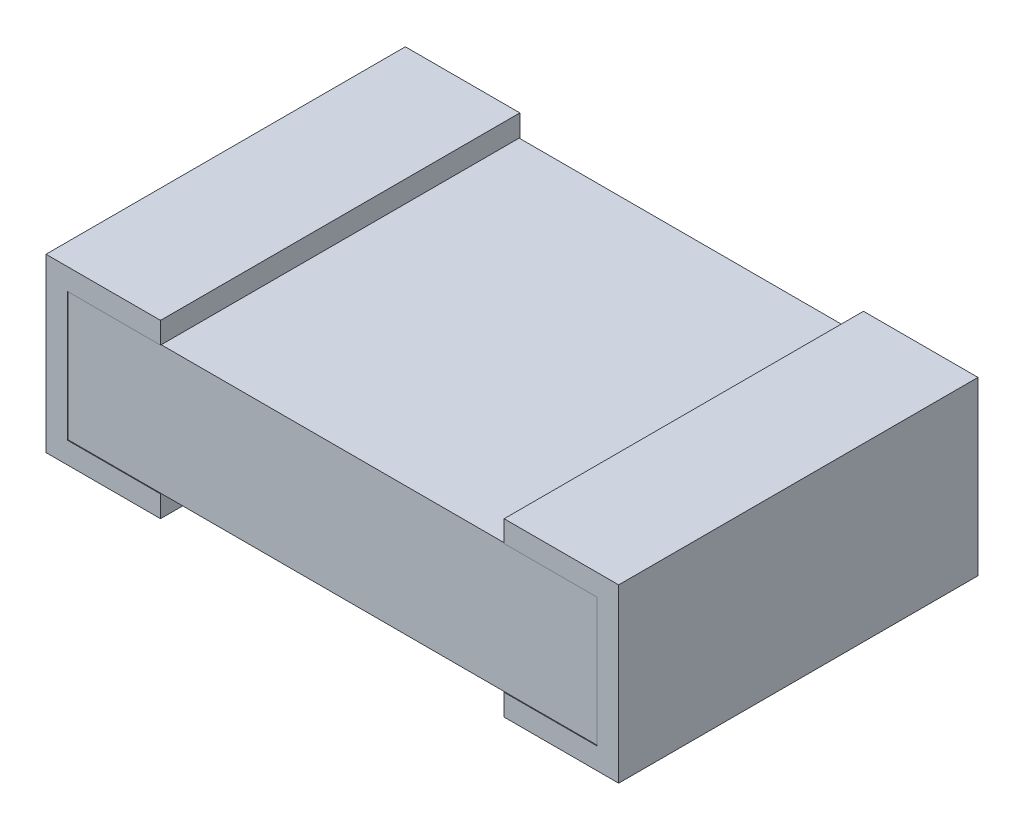
ISO-10303-21;
HEADER;
FILE_DESCRIPTION(('STEP AP214'),'2;1');
FILE_NAME('part.step','',(''),(''),'','','');
FILE_SCHEMA(('AUTOMOTIVE_DESIGN { 1 0 10303 214 1 1 1 1 }'));
ENDSEC;
DATA;
#1=APPLICATION_CONTEXT('core data for automotive mechanical design processes');
#2=APPLICATION_PROTOCOL_DEFINITION('international standard','automotive_design',2000,#1);
#3=PRODUCT_CONTEXT('',#1,'mechanical');
#4=PRODUCT('Part','Part','',(#3));
#5=PRODUCT_RELATED_PRODUCT_CATEGORY('part','',(#4));
#6=PRODUCT_DEFINITION_FORMATION('','',#4);
#7=PRODUCT_DEFINITION_CONTEXT('part definition',#1,'design');
#8=PRODUCT_DEFINITION('design','',#6,#7);
#9=PRODUCT_DEFINITION_SHAPE('','',#8);
#10=(LENGTH_UNIT() NAMED_UNIT(*) SI_UNIT(.MILLI.,.METRE.));
#11=(NAMED_UNIT(*) PLANE_ANGLE_UNIT() SI_UNIT($,.RADIAN.));
#12=(NAMED_UNIT(*) SI_UNIT($,.STERADIAN.) SOLID_ANGLE_UNIT());
#13=UNCERTAINTY_MEASURE_WITH_UNIT(LENGTH_MEASURE(1.E-05),#10,'distance_accuracy_value','');
#14=(GEOMETRIC_REPRESENTATION_CONTEXT(3) GLOBAL_UNCERTAINTY_ASSIGNED_CONTEXT((#13)) GLOBAL_UNIT_ASSIGNED_CONTEXT((#10,
#11,#12)) REPRESENTATION_CONTEXT('',''));
#15=CARTESIAN_POINT('',(0.,0.,0.));
#16=DIRECTION('',(0.,0.,1.));
#17=DIRECTION('',(1.,0.,0.));
#18=AXIS2_PLACEMENT_3D('',#15,#16,#17);
#19=CARTESIAN_POINT('',(1.9558,0.0762000000000002,-0.635));
#20=DIRECTION('',(0.,-1.,0.));
#21=DIRECTION('',(1.,0.,0.));
#22=AXIS2_PLACEMENT_3D('',#19,#20,#21);
#23=PLANE('',#22);
#24=DIRECTION('',(1.,0.,0.));
#25=VECTOR('',#24,1.);
#26=CARTESIAN_POINT('',(1.9558,0.0762000000000002,-0.635));
#27=LINE('',#26,#25);
#28=CARTESIAN_POINT('',(0.4064,0.0762000000000001,-0.635));
#29=VERTEX_POINT('',#28);
#30=CARTESIAN_POINT('',(1.6256,0.0762000000000001,-0.635));
#31=VERTEX_POINT('',#30);
#32=EDGE_CURVE('E41',#29,#31,#27,.T.);
#33=ORIENTED_EDGE('',*,*,#32,.T.);
#34=DIRECTION('',(0.,0.,-1.));
#35=VECTOR('',#34,1.);
#36=CARTESIAN_POINT('',(1.6256,0.0762000000000001,0.63754));
#37=LINE('',#36,#35);
#38=CARTESIAN_POINT('',(1.6256,0.0762000000000001,0.635));
#39=VERTEX_POINT('',#38);
#40=EDGE_CURVE('E272',#39,#31,#37,.T.);
#41=ORIENTED_EDGE('',*,*,#40,.F.);
#42=DIRECTION('',(1.,0.,0.));
#43=VECTOR('',#42,1.);
#44=CARTESIAN_POINT('',(1.9558,0.0762000000000002,0.635));
#45=LINE('',#44,#43);
#46=CARTESIAN_POINT('',(0.4064,0.0762000000000001,0.635));
#47=VERTEX_POINT('',#46);
#48=EDGE_CURVE('E371',#47,#39,#45,.T.);
#49=ORIENTED_EDGE('',*,*,#48,.F.);
#50=DIRECTION('',(0.,0.,-1.));
#51=VECTOR('',#50,1.);
#52=CARTESIAN_POINT('',(0.4064,0.0762000000000001,0.63754));
#53=LINE('',#52,#51);
#54=EDGE_CURVE('E333',#47,#29,#53,.T.);
#55=ORIENTED_EDGE('',*,*,#54,.T.);
#56=EDGE_LOOP('',(#33,#41,#49,#55));
#57=FACE_BOUND('',#56,.T.);
#58=ADVANCED_FACE('F32',(#57),#23,.T.);
#59=CARTESIAN_POINT('',(0.0762,0.5334,-0.635));
#60=DIRECTION('',(0.,1.,0.));
#61=DIRECTION('',(-1.,0.,0.));
#62=AXIS2_PLACEMENT_3D('',#59,#60,#61);
#63=PLANE('',#62);
#64=DIRECTION('',(-1.,0.,0.));
#65=VECTOR('',#64,1.);
#66=CARTESIAN_POINT('',(0.0762,0.5334,0.635));
#67=LINE('',#66,#65);
#68=CARTESIAN_POINT('',(1.6256,0.5334,0.635));
#69=VERTEX_POINT('',#68);
#70=CARTESIAN_POINT('',(0.4064,0.5334,0.635));
#71=VERTEX_POINT('',#70);
#72=EDGE_CURVE('E364',#69,#71,#67,.T.);
#73=ORIENTED_EDGE('',*,*,#72,.F.);
#74=DIRECTION('',(0.,0.,-1.));
#75=VECTOR('',#74,1.);
#76=CARTESIAN_POINT('',(1.6256,0.5334,0.63754));
#77=LINE('',#76,#75);
#78=CARTESIAN_POINT('',(1.6256,0.5334,-0.635));
#79=VERTEX_POINT('',#78);
#80=EDGE_CURVE('E261',#69,#79,#77,.T.);
#81=ORIENTED_EDGE('',*,*,#80,.T.);
#82=DIRECTION('',(-1.,0.,0.));
#83=VECTOR('',#82,1.);
#84=CARTESIAN_POINT('',(0.0762,0.5334,-0.635));
#85=LINE('',#84,#83);
#86=CARTESIAN_POINT('',(0.4064,0.5334,-0.635));
#87=VERTEX_POINT('',#86);
#88=EDGE_CURVE('E353',#79,#87,#85,.T.);
#89=ORIENTED_EDGE('',*,*,#88,.T.);
#90=DIRECTION('',(0.,0.,-1.));
#91=VECTOR('',#90,1.);
#92=CARTESIAN_POINT('',(0.4064,0.5334,0.63754));
#93=LINE('',#92,#91);
#94=EDGE_CURVE('E344',#71,#87,#93,.T.);
#95=ORIENTED_EDGE('',*,*,#94,.F.);
#96=EDGE_LOOP('',(#73,#81,#89,#95));
#97=FACE_BOUND('',#96,.T.);
#98=ADVANCED_FACE('F34',(#97),#63,.T.);
#99=CARTESIAN_POINT('',(1.9558,0.5334,-0.635));
#100=DIRECTION('',(0.,0.,-1.));
#101=DIRECTION('',(-1.,0.,0.));
#102=AXIS2_PLACEMENT_3D('',#99,#100,#101);
#103=PLANE('',#102);
#104=DIRECTION('',(0.,1.,0.));
#105=VECTOR('',#104,1.);
#106=CARTESIAN_POINT('',(1.9558,0.0762000000000002,-0.635));
#107=LINE('',#106,#105);
#108=CARTESIAN_POINT('',(1.9558,0.0762,-0.635));
#109=VERTEX_POINT('',#108);
#110=CARTESIAN_POINT('',(1.9558,0.5334,-0.635));
#111=VERTEX_POINT('',#110);
#112=EDGE_CURVE('E351',#109,#111,#107,.T.);
#113=ORIENTED_EDGE('',*,*,#112,.F.);
#114=DIRECTION('',(-1.,0.,0.));
#115=VECTOR('',#114,1.);
#116=CARTESIAN_POINT('',(1.9558,0.0762,-0.635));
#117=LINE('',#116,#115);
#118=EDGE_CURVE('E254',#109,#31,#117,.T.);
#119=ORIENTED_EDGE('',*,*,#118,.T.);
#120=ORIENTED_EDGE('',*,*,#32,.F.);
#121=CARTESIAN_POINT('',(0.0762,0.0762,-0.635));
#122=VERTEX_POINT('',#121);
#123=EDGE_CURVE('E11',#122,#29,#27,.T.);
#124=ORIENTED_EDGE('',*,*,#123,.F.);
#125=DIRECTION('',(0.,-1.,0.));
#126=VECTOR('',#125,1.);
#127=CARTESIAN_POINT('',(0.0762,0.5334,-0.635));
#128=LINE('',#127,#126);
#129=CARTESIAN_POINT('',(0.0762,0.5334,-0.635));
#130=VERTEX_POINT('',#129);
#131=EDGE_CURVE('E356',#130,#122,#128,.T.);
#132=ORIENTED_EDGE('',*,*,#131,.F.);
#133=DIRECTION('',(-1.,0.,0.));
#134=VECTOR('',#133,1.);
#135=CARTESIAN_POINT('',(1.9558,0.5334,-0.635));
#136=LINE('',#135,#134);
#137=EDGE_CURVE('E327',#87,#130,#136,.T.);
#138=ORIENTED_EDGE('',*,*,#137,.F.);
#139=ORIENTED_EDGE('',*,*,#88,.F.);
#140=EDGE_CURVE('E354',#111,#79,#85,.T.);
#141=ORIENTED_EDGE('',*,*,#140,.F.);
#142=EDGE_LOOP('',(#113,#119,#120,#124,#132,#138,#139,#141));
#143=FACE_BOUND('',#142,.T.);
#144=ADVANCED_FACE('F435',(#143),#103,.T.);
#145=CARTESIAN_POINT('',(1.9558,0.5334,0.635));
#146=DIRECTION('',(0.,0.,-1.));
#147=DIRECTION('',(-1.,0.,0.));
#148=AXIS2_PLACEMENT_3D('',#145,#146,#147);
#149=PLANE('',#148);
#150=DIRECTION('',(0.,1.,0.));
#151=VECTOR('',#150,1.);
#152=CARTESIAN_POINT('',(1.9558,0.0762000000000002,0.635));
#153=LINE('',#152,#151);
#154=CARTESIAN_POINT('',(1.9558,0.0762000000000002,0.635));
#155=VERTEX_POINT('',#154);
#156=CARTESIAN_POINT('',(1.9558,0.5334,0.635));
#157=VERTEX_POINT('',#156);
#158=EDGE_CURVE('E350',#155,#157,#153,.T.);
#159=ORIENTED_EDGE('',*,*,#158,.T.);
#160=EDGE_CURVE('E361',#157,#69,#67,.T.);
#161=ORIENTED_EDGE('',*,*,#160,.T.);
#162=ORIENTED_EDGE('',*,*,#72,.T.);
#163=CARTESIAN_POINT('',(0.0762,0.5334,0.635));
#164=VERTEX_POINT('',#163);
#165=EDGE_CURVE('E360',#71,#164,#67,.T.);
#166=ORIENTED_EDGE('',*,*,#165,.T.);
#167=DIRECTION('',(0.,-1.,0.));
#168=VECTOR('',#167,1.);
#169=CARTESIAN_POINT('',(0.0762,0.5334,0.635));
#170=LINE('',#169,#168);
#171=CARTESIAN_POINT('',(0.0762,0.0762,0.635));
#172=VERTEX_POINT('',#171);
#173=EDGE_CURVE('E363',#164,#172,#170,.T.);
#174=ORIENTED_EDGE('',*,*,#173,.T.);
#175=EDGE_CURVE('E36',#172,#47,#45,.T.);
#176=ORIENTED_EDGE('',*,*,#175,.T.);
#177=ORIENTED_EDGE('',*,*,#48,.T.);
#178=EDGE_CURVE('E366',#39,#155,#45,.T.);
#179=ORIENTED_EDGE('',*,*,#178,.T.);
#180=EDGE_LOOP('',(#159,#161,#162,#166,#174,#176,#177,#179));
#181=FACE_BOUND('',#180,.T.);
#182=ADVANCED_FACE('F373',(#181),#149,.F.);
#183=CARTESIAN_POINT('',(0.0762,0.0762,0.63754));
#184=DIRECTION('',(0.,1.,0.));
#185=DIRECTION('',(-1.,0.,0.));
#186=AXIS2_PLACEMENT_3D('',#183,#184,#185);
#187=PLANE('',#186);
#188=ORIENTED_EDGE('',*,*,#175,.F.);
#189=DIRECTION('',(0.,0.,-1.));
#190=VECTOR('',#189,1.);
#191=CARTESIAN_POINT('',(0.0762,0.0762,0.63754));
#192=LINE('',#191,#190);
#193=CARTESIAN_POINT('',(0.0762,0.0762,0.63754));
#194=VERTEX_POINT('',#193);
#195=EDGE_CURVE('E335',#194,#172,#192,.T.);
#196=ORIENTED_EDGE('',*,*,#195,.F.);
#197=DIRECTION('',(1.,0.,0.));
#198=VECTOR('',#197,1.);
#199=CARTESIAN_POINT('',(0.0762,0.0762,0.63754));
#200=LINE('',#199,#198);
#201=CARTESIAN_POINT('',(0.4064,0.0762000000000001,0.63754));
#202=VERTEX_POINT('',#201);
#203=EDGE_CURVE('E293',#194,#202,#200,.T.);
#204=ORIENTED_EDGE('',*,*,#203,.T.);
#205=EDGE_CURVE('E330',#202,#47,#53,.T.);
#206=ORIENTED_EDGE('',*,*,#205,.T.);
#207=EDGE_LOOP('',(#188,#196,#204,#206));
#208=FACE_BOUND('',#207,.T.);
#209=ADVANCED_FACE('F376',(#208),#187,.T.);
#210=CARTESIAN_POINT('',(0.0762,0.5334,0.63754));
#211=DIRECTION('',(1.,0.,0.));
#212=DIRECTION('',(0.,0.,-1.));
#213=AXIS2_PLACEMENT_3D('',#210,#211,#212);
#214=PLANE('',#213);
#215=ORIENTED_EDGE('',*,*,#173,.F.);
#216=DIRECTION('',(0.,0.,-1.));
#217=VECTOR('',#216,1.);
#218=CARTESIAN_POINT('',(0.0762,0.5334,0.63754));
#219=LINE('',#218,#217);
#220=CARTESIAN_POINT('',(0.0762,0.5334,0.63754));
#221=VERTEX_POINT('',#220);
#222=EDGE_CURVE('E57',#221,#164,#219,.T.);
#223=ORIENTED_EDGE('',*,*,#222,.F.);
#224=DIRECTION('',(0.,-1.,0.));
#225=VECTOR('',#224,1.);
#226=CARTESIAN_POINT('',(0.0762,0.5334,0.63754));
#227=LINE('',#226,#225);
#228=EDGE_CURVE('E290',#221,#194,#227,.T.);
#229=ORIENTED_EDGE('',*,*,#228,.T.);
#230=ORIENTED_EDGE('',*,*,#195,.T.);
#231=EDGE_LOOP('',(#215,#223,#229,#230));
#232=FACE_BOUND('',#231,.T.);
#233=ADVANCED_FACE('F379',(#232),#214,.T.);
#234=CARTESIAN_POINT('',(0.4064,0.5334,0.63754));
#235=DIRECTION('',(0.,-1.,0.));
#236=DIRECTION('',(0.,0.,-1.));
#237=AXIS2_PLACEMENT_3D('',#234,#235,#236);
#238=PLANE('',#237);
#239=ORIENTED_EDGE('',*,*,#165,.F.);
#240=CARTESIAN_POINT('',(0.4064,0.5334,0.63754));
#241=VERTEX_POINT('',#240);
#242=EDGE_CURVE('E341',#241,#71,#93,.T.);
#243=ORIENTED_EDGE('',*,*,#242,.F.);
#244=DIRECTION('',(-1.,0.,0.));
#245=VECTOR('',#244,1.);
#246=CARTESIAN_POINT('',(0.4064,0.5334,0.63754));
#247=LINE('',#246,#245);
#248=EDGE_CURVE('E288',#241,#221,#247,.T.);
#249=ORIENTED_EDGE('',*,*,#248,.T.);
#250=ORIENTED_EDGE('',*,*,#222,.T.);
#251=EDGE_LOOP('',(#239,#243,#249,#250));
#252=FACE_BOUND('',#251,.T.);
#253=ADVANCED_FACE('F387',(#252),#238,.T.);
#254=CARTESIAN_POINT('',(0.,0.,0.63754));
#255=DIRECTION('',(-1.,0.,0.));
#256=DIRECTION('',(0.,0.,1.));
#257=AXIS2_PLACEMENT_3D('',#254,#255,#256);
#258=PLANE('',#257);
#259=DIRECTION('',(0.,1.,0.));
#260=VECTOR('',#259,1.);
#261=CARTESIAN_POINT('',(0.,0.,-0.63754));
#262=LINE('',#261,#260);
#263=CARTESIAN_POINT('',(0.,0.,-0.63754));
#264=VERTEX_POINT('',#263);
#265=CARTESIAN_POINT('',(0.,0.6096,-0.63754));
#266=VERTEX_POINT('',#265);
#267=EDGE_CURVE('E277',#264,#266,#262,.T.);
#268=ORIENTED_EDGE('',*,*,#267,.F.);
#269=DIRECTION('',(0.,0.,-1.));
#270=VECTOR('',#269,1.);
#271=CARTESIAN_POINT('',(0.,0.,0.63754));
#272=LINE('',#271,#270);
#273=CARTESIAN_POINT('',(0.,0.,0.63754));
#274=VERTEX_POINT('',#273);
#275=EDGE_CURVE('E325',#274,#264,#272,.T.);
#276=ORIENTED_EDGE('',*,*,#275,.F.);
#277=DIRECTION('',(0.,1.,0.));
#278=VECTOR('',#277,1.);
#279=CARTESIAN_POINT('',(0.,0.,0.63754));
#280=LINE('',#279,#278);
#281=CARTESIAN_POINT('',(0.,0.6096,0.63754));
#282=VERTEX_POINT('',#281);
#283=EDGE_CURVE('E278',#274,#282,#280,.T.);
#284=ORIENTED_EDGE('',*,*,#283,.T.);
#285=DIRECTION('',(0.,0.,-1.));
#286=VECTOR('',#285,1.);
#287=CARTESIAN_POINT('',(0.,0.6096,0.63754));
#288=LINE('',#287,#286);
#289=EDGE_CURVE('E302',#282,#266,#288,.T.);
#290=ORIENTED_EDGE('',*,*,#289,.T.);
#291=EDGE_LOOP('',(#268,#276,#284,#290));
#292=FACE_BOUND('',#291,.T.);
#293=ADVANCED_FACE('F413',(#292),#258,.T.);
#294=CARTESIAN_POINT('',(0.,0.,0.63754));
#295=DIRECTION('',(0.,-1.,0.));
#296=DIRECTION('',(1.,0.,0.));
#297=AXIS2_PLACEMENT_3D('',#294,#295,#296);
#298=PLANE('',#297);
#299=DIRECTION('',(-1.,0.,0.));
#300=VECTOR('',#299,1.);
#301=CARTESIAN_POINT('',(0.,0.,-0.63754));
#302=LINE('',#301,#300);
#303=CARTESIAN_POINT('',(0.4064,0.,-0.63754));
#304=VERTEX_POINT('',#303);
#305=EDGE_CURVE('E282',#304,#264,#302,.T.);
#306=ORIENTED_EDGE('',*,*,#305,.F.);
#307=DIRECTION('',(0.,0.,-1.));
#308=VECTOR('',#307,1.);
#309=CARTESIAN_POINT('',(0.4064,0.,0.63754));
#310=LINE('',#309,#308);
#311=CARTESIAN_POINT('',(0.4064,0.,0.63754));
#312=VERTEX_POINT('',#311);
#313=EDGE_CURVE('E328',#312,#304,#310,.T.);
#314=ORIENTED_EDGE('',*,*,#313,.F.);
#315=DIRECTION('',(-1.,0.,0.));
#316=VECTOR('',#315,1.);
#317=CARTESIAN_POINT('',(0.,0.,0.63754));
#318=LINE('',#317,#316);
#319=EDGE_CURVE('E299',#312,#274,#318,.T.);
#320=ORIENTED_EDGE('',*,*,#319,.T.);
#321=ORIENTED_EDGE('',*,*,#275,.T.);
#322=EDGE_LOOP('',(#306,#314,#320,#321));
#323=FACE_BOUND('',#322,.T.);
#324=ADVANCED_FACE('F416',(#323),#298,.T.);
#325=CARTESIAN_POINT('',(0.4064,0.,0.63754));
#326=DIRECTION('',(1.,0.,0.));
#327=DIRECTION('',(0.,0.,-1.));
#328=AXIS2_PLACEMENT_3D('',#325,#326,#327);
#329=PLANE('',#328);
#330=DIRECTION('',(0.,-1.,0.));
#331=VECTOR('',#330,1.);
#332=CARTESIAN_POINT('',(0.4064,0.,-0.63754));
#333=LINE('',#332,#331);
#334=CARTESIAN_POINT('',(0.4064,0.0762000000000001,-0.63754));
#335=VERTEX_POINT('',#334);
#336=EDGE_CURVE('E320',#335,#304,#333,.T.);
#337=ORIENTED_EDGE('',*,*,#336,.F.);
#338=EDGE_CURVE('E334',#29,#335,#53,.T.);
#339=ORIENTED_EDGE('',*,*,#338,.F.);
#340=ORIENTED_EDGE('',*,*,#54,.F.);
#341=ORIENTED_EDGE('',*,*,#205,.F.);
#342=DIRECTION('',(0.,-1.,0.));
#343=VECTOR('',#342,1.);
#344=CARTESIAN_POINT('',(0.4064,0.,0.63754));
#345=LINE('',#344,#343);
#346=EDGE_CURVE('E296',#202,#312,#345,.T.);
#347=ORIENTED_EDGE('',*,*,#346,.T.);
#348=ORIENTED_EDGE('',*,*,#313,.T.);
#349=EDGE_LOOP('',(#337,#339,#340,#341,#347,#348));
#350=FACE_BOUND('',#349,.T.);
#351=ADVANCED_FACE('F419',(#350),#329,.T.);
#352=CARTESIAN_POINT('',(0.0762,0.0762,-0.63754));
#353=VERTEX_POINT('',#352);
#354=EDGE_CURVE('E338',#122,#353,#192,.T.);
#355=ORIENTED_EDGE('',*,*,#354,.F.);
#356=ORIENTED_EDGE('',*,*,#123,.T.);
#357=ORIENTED_EDGE('',*,*,#338,.T.);
#358=DIRECTION('',(1.,0.,0.));
#359=VECTOR('',#358,1.);
#360=CARTESIAN_POINT('',(0.0762,0.0762,-0.63754));
#361=LINE('',#360,#359);
#362=EDGE_CURVE('E317',#353,#335,#361,.T.);
#363=ORIENTED_EDGE('',*,*,#362,.F.);
#364=EDGE_LOOP('',(#355,#356,#357,#363));
#365=FACE_BOUND('',#364,.T.);
#366=ADVANCED_FACE('F428',(#365),#187,.T.);
#367=CARTESIAN_POINT('',(0.0762,0.5334,-0.63754));
#368=VERTEX_POINT('',#367);
#369=EDGE_CURVE('E340',#130,#368,#219,.T.);
#370=ORIENTED_EDGE('',*,*,#369,.F.);
#371=ORIENTED_EDGE('',*,*,#131,.T.);
#372=ORIENTED_EDGE('',*,*,#354,.T.);
#373=DIRECTION('',(0.,-1.,0.));
#374=VECTOR('',#373,1.);
#375=CARTESIAN_POINT('',(0.0762,0.5334,-0.63754));
#376=LINE('',#375,#374);
#377=EDGE_CURVE('E314',#368,#353,#376,.T.);
#378=ORIENTED_EDGE('',*,*,#377,.F.);
#379=EDGE_LOOP('',(#370,#371,#372,#378));
#380=FACE_BOUND('',#379,.T.);
#381=ADVANCED_FACE('F431',(#380),#214,.T.);
#382=CARTESIAN_POINT('',(0.4064,0.5334,-0.63754));
#383=VERTEX_POINT('',#382);
#384=EDGE_CURVE('E345',#87,#383,#93,.T.);
#385=ORIENTED_EDGE('',*,*,#384,.F.);
#386=ORIENTED_EDGE('',*,*,#137,.T.);
#387=ORIENTED_EDGE('',*,*,#369,.T.);
#388=DIRECTION('',(-1.,0.,0.));
#389=VECTOR('',#388,1.);
#390=CARTESIAN_POINT('',(0.4064,0.5334,-0.63754));
#391=LINE('',#390,#389);
#392=EDGE_CURVE('E311',#383,#368,#391,.T.);
#393=ORIENTED_EDGE('',*,*,#392,.F.);
#394=EDGE_LOOP('',(#385,#386,#387,#393));
#395=FACE_BOUND('',#394,.T.);
#396=ADVANCED_FACE('F401',(#395),#238,.T.);
#397=CARTESIAN_POINT('',(0.4064,0.6096,0.63754));
#398=DIRECTION('',(1.,0.,0.));
#399=DIRECTION('',(0.,1.,0.));
#400=AXIS2_PLACEMENT_3D('',#397,#398,#399);
#401=PLANE('',#400);
#402=DIRECTION('',(0.,-1.,0.));
#403=VECTOR('',#402,1.);
#404=CARTESIAN_POINT('',(0.4064,0.6096,-0.63754));
#405=LINE('',#404,#403);
#406=CARTESIAN_POINT('',(0.4064,0.6096,-0.63754));
#407=VERTEX_POINT('',#406);
#408=EDGE_CURVE('E308',#407,#383,#405,.T.);
#409=ORIENTED_EDGE('',*,*,#408,.F.);
#410=DIRECTION('',(0.,0.,-1.));
#411=VECTOR('',#410,1.);
#412=CARTESIAN_POINT('',(0.4064,0.6096,0.63754));
#413=LINE('',#412,#411);
#414=CARTESIAN_POINT('',(0.4064,0.6096,0.63754));
#415=VERTEX_POINT('',#414);
#416=EDGE_CURVE('E346',#415,#407,#413,.T.);
#417=ORIENTED_EDGE('',*,*,#416,.F.);
#418=DIRECTION('',(0.,-1.,0.));
#419=VECTOR('',#418,1.);
#420=CARTESIAN_POINT('',(0.4064,0.6096,0.63754));
#421=LINE('',#420,#419);
#422=EDGE_CURVE('E285',#415,#241,#421,.T.);
#423=ORIENTED_EDGE('',*,*,#422,.T.);
#424=ORIENTED_EDGE('',*,*,#242,.T.);
#425=ORIENTED_EDGE('',*,*,#94,.T.);
#426=ORIENTED_EDGE('',*,*,#384,.T.);
#427=EDGE_LOOP('',(#409,#417,#423,#424,#425,#426));
#428=FACE_BOUND('',#427,.T.);
#429=ADVANCED_FACE('F392',(#428),#401,.T.);
#430=CARTESIAN_POINT('',(0.,0.6096,0.63754));
#431=DIRECTION('',(0.,1.,0.));
#432=DIRECTION('',(0.,0.,1.));
#433=AXIS2_PLACEMENT_3D('',#430,#431,#432);
#434=PLANE('',#433);
#435=DIRECTION('',(1.,0.,0.));
#436=VECTOR('',#435,1.);
#437=CARTESIAN_POINT('',(0.,0.6096,-0.63754));
#438=LINE('',#437,#436);
#439=EDGE_CURVE('E305',#266,#407,#438,.T.);
#440=ORIENTED_EDGE('',*,*,#439,.F.);
#441=ORIENTED_EDGE('',*,*,#289,.F.);
#442=DIRECTION('',(1.,0.,0.));
#443=VECTOR('',#442,1.);
#444=CARTESIAN_POINT('',(0.,0.6096,0.63754));
#445=LINE('',#444,#443);
#446=EDGE_CURVE('E281',#282,#415,#445,.T.);
#447=ORIENTED_EDGE('',*,*,#446,.T.);
#448=ORIENTED_EDGE('',*,*,#416,.T.);
#449=EDGE_LOOP('',(#440,#441,#447,#448));
#450=FACE_BOUND('',#449,.T.);
#451=ADVANCED_FACE('F409',(#450),#434,.T.);
#452=CARTESIAN_POINT('',(0.,0.6096,0.63754));
#453=DIRECTION('',(0.,0.,-1.));
#454=DIRECTION('',(-1.,0.,0.));
#455=AXIS2_PLACEMENT_3D('',#452,#453,#454);
#456=PLANE('',#455);
#457=ORIENTED_EDGE('',*,*,#283,.F.);
#458=ORIENTED_EDGE('',*,*,#319,.F.);
#459=ORIENTED_EDGE('',*,*,#346,.F.);
#460=ORIENTED_EDGE('',*,*,#203,.F.);
#461=ORIENTED_EDGE('',*,*,#228,.F.);
#462=ORIENTED_EDGE('',*,*,#248,.F.);
#463=ORIENTED_EDGE('',*,*,#422,.F.);
#464=ORIENTED_EDGE('',*,*,#446,.F.);
#465=EDGE_LOOP('',(#457,#458,#459,#460,#461,#462,#463,#464));
#466=FACE_BOUND('',#465,.T.);
#467=ADVANCED_FACE('F384',(#466),#456,.F.);
#468=CARTESIAN_POINT('',(0.,0.6096,-0.63754));
#469=DIRECTION('',(0.,0.,-1.));
#470=DIRECTION('',(-1.,0.,0.));
#471=AXIS2_PLACEMENT_3D('',#468,#469,#470);
#472=PLANE('',#471);
#473=ORIENTED_EDGE('',*,*,#267,.T.);
#474=ORIENTED_EDGE('',*,*,#439,.T.);
#475=ORIENTED_EDGE('',*,*,#408,.T.);
#476=ORIENTED_EDGE('',*,*,#392,.T.);
#477=ORIENTED_EDGE('',*,*,#377,.T.);
#478=ORIENTED_EDGE('',*,*,#362,.T.);
#479=ORIENTED_EDGE('',*,*,#336,.T.);
#480=ORIENTED_EDGE('',*,*,#305,.T.);
#481=EDGE_LOOP('',(#473,#474,#475,#476,#477,#478,#479,#480));
#482=FACE_BOUND('',#481,.T.);
#483=ADVANCED_FACE('F405',(#482),#472,.T.);
#484=CARTESIAN_POINT('',(1.6256,0.5334,0.63754));
#485=DIRECTION('',(0.,1.,0.));
#486=DIRECTION('',(0.,0.,1.));
#487=AXIS2_PLACEMENT_3D('',#484,#485,#486);
#488=PLANE('',#487);
#489=CARTESIAN_POINT('',(1.6256,0.5334,0.63754));
#490=VERTEX_POINT('',#489);
#491=EDGE_CURVE('E258',#490,#69,#77,.T.);
#492=ORIENTED_EDGE('',*,*,#491,.T.);
#493=ORIENTED_EDGE('',*,*,#160,.F.);
#494=DIRECTION('',(0.,0.,-1.));
#495=VECTOR('',#494,1.);
#496=CARTESIAN_POINT('',(1.9558,0.5334,0.63754));
#497=LINE('',#496,#495);
#498=CARTESIAN_POINT('',(1.9558,0.5334,0.63754));
#499=VERTEX_POINT('',#498);
#500=EDGE_CURVE('E263',#499,#157,#497,.T.);
#501=ORIENTED_EDGE('',*,*,#500,.F.);
#502=DIRECTION('',(1.,0.,0.));
#503=VECTOR('',#502,1.);
#504=CARTESIAN_POINT('',(1.6256,0.5334,0.63754));
#505=LINE('',#504,#503);
#506=EDGE_CURVE('E232',#490,#499,#505,.T.);
#507=ORIENTED_EDGE('',*,*,#506,.F.);
#508=EDGE_LOOP('',(#492,#493,#501,#507));
#509=FACE_BOUND('',#508,.T.);
#510=ADVANCED_FACE('F461',(#509),#488,.F.);
#511=CARTESIAN_POINT('',(1.9558,0.5334,0.63754));
#512=DIRECTION('',(1.,0.,0.));
#513=DIRECTION('',(0.,0.,-1.));
#514=AXIS2_PLACEMENT_3D('',#511,#512,#513);
#515=PLANE('',#514);
#516=ORIENTED_EDGE('',*,*,#500,.T.);
#517=ORIENTED_EDGE('',*,*,#158,.F.);
#518=DIRECTION('',(0.,0.,-1.));
#519=VECTOR('',#518,1.);
#520=CARTESIAN_POINT('',(1.9558,0.0762,0.63754));
#521=LINE('',#520,#519);
#522=CARTESIAN_POINT('',(1.9558,0.0762,0.63754));
#523=VERTEX_POINT('',#522);
#524=EDGE_CURVE('E49',#523,#155,#521,.T.);
#525=ORIENTED_EDGE('',*,*,#524,.F.);
#526=DIRECTION('',(0.,-1.,0.));
#527=VECTOR('',#526,1.);
#528=CARTESIAN_POINT('',(1.9558,0.5334,0.63754));
#529=LINE('',#528,#527);
#530=EDGE_CURVE('E230',#499,#523,#529,.T.);
#531=ORIENTED_EDGE('',*,*,#530,.F.);
#532=EDGE_LOOP('',(#516,#517,#525,#531));
#533=FACE_BOUND('',#532,.T.);
#534=ADVANCED_FACE('F464',(#533),#515,.F.);
#535=CARTESIAN_POINT('',(1.9558,0.0762,0.63754));
#536=DIRECTION('',(0.,-1.,0.));
#537=DIRECTION('',(1.,0.,0.));
#538=AXIS2_PLACEMENT_3D('',#535,#536,#537);
#539=PLANE('',#538);
#540=ORIENTED_EDGE('',*,*,#524,.T.);
#541=ORIENTED_EDGE('',*,*,#178,.F.);
#542=CARTESIAN_POINT('',(1.6256,0.0762000000000001,0.63754));
#543=VERTEX_POINT('',#542);
#544=EDGE_CURVE('E269',#543,#39,#37,.T.);
#545=ORIENTED_EDGE('',*,*,#544,.F.);
#546=DIRECTION('',(-1.,0.,0.));
#547=VECTOR('',#546,1.);
#548=CARTESIAN_POINT('',(1.9558,0.0762,0.63754));
#549=LINE('',#548,#547);
#550=EDGE_CURVE('E228',#523,#543,#549,.T.);
#551=ORIENTED_EDGE('',*,*,#550,.F.);
#552=EDGE_LOOP('',(#540,#541,#545,#551));
#553=FACE_BOUND('',#552,.T.);
#554=ADVANCED_FACE('F466',(#553),#539,.F.);
#555=CARTESIAN_POINT('',(2.032,0.,0.63754));
#556=DIRECTION('',(-1.,0.,0.));
#557=DIRECTION('',(0.,0.,1.));
#558=AXIS2_PLACEMENT_3D('',#555,#556,#557);
#559=PLANE('',#558);
#560=DIRECTION('',(0.,1.,0.));
#561=VECTOR('',#560,1.);
#562=CARTESIAN_POINT('',(2.032,0.,-0.63754));
#563=LINE('',#562,#561);
#564=CARTESIAN_POINT('',(2.032,0.,-0.63754));
#565=VERTEX_POINT('',#564);
#566=CARTESIAN_POINT('',(2.032,0.6096,-0.63754));
#567=VERTEX_POINT('',#566);
#568=EDGE_CURVE('E237',#565,#567,#563,.T.);
#569=ORIENTED_EDGE('',*,*,#568,.T.);
#570=DIRECTION('',(0.,0.,-1.));
#571=VECTOR('',#570,1.);
#572=CARTESIAN_POINT('',(2.032,0.6096,0.63754));
#573=LINE('',#572,#571);
#574=CARTESIAN_POINT('',(2.032,0.6096,0.63754));
#575=VERTEX_POINT('',#574);
#576=EDGE_CURVE('E221',#575,#567,#573,.T.);
#577=ORIENTED_EDGE('',*,*,#576,.F.);
#578=DIRECTION('',(0.,1.,0.));
#579=VECTOR('',#578,1.);
#580=CARTESIAN_POINT('',(2.032,0.,0.63754));
#581=LINE('',#580,#579);
#582=CARTESIAN_POINT('',(2.032,0.,0.63754));
#583=VERTEX_POINT('',#582);
#584=EDGE_CURVE('E200',#583,#575,#581,.T.);
#585=ORIENTED_EDGE('',*,*,#584,.F.);
#586=DIRECTION('',(0.,0.,-1.));
#587=VECTOR('',#586,1.);
#588=CARTESIAN_POINT('',(2.032,0.,0.63754));
#589=LINE('',#588,#587);
#590=EDGE_CURVE('E209',#583,#565,#589,.T.);
#591=ORIENTED_EDGE('',*,*,#590,.T.);
#592=EDGE_LOOP('',(#569,#577,#585,#591));
#593=FACE_BOUND('',#592,.T.);
#594=ADVANCED_FACE('F219',(#593),#559,.F.);
#595=CARTESIAN_POINT('',(2.032,0.6096,0.63754));
#596=DIRECTION('',(0.,-1.,0.));
#597=DIRECTION('',(0.,0.,-1.));
#598=AXIS2_PLACEMENT_3D('',#595,#596,#597);
#599=PLANE('',#598);
#600=DIRECTION('',(-1.,0.,0.));
#601=VECTOR('',#600,1.);
#602=CARTESIAN_POINT('',(2.032,0.6096,-0.63754));
#603=LINE('',#602,#601);
#604=CARTESIAN_POINT('',(1.6256,0.6096,-0.63754));
#605=VERTEX_POINT('',#604);
#606=EDGE_CURVE('E222',#567,#605,#603,.T.);
#607=ORIENTED_EDGE('',*,*,#606,.T.);
#608=DIRECTION('',(0.,0.,-1.));
#609=VECTOR('',#608,1.);
#610=CARTESIAN_POINT('',(1.6256,0.6096,0.63754));
#611=LINE('',#610,#609);
#612=CARTESIAN_POINT('',(1.6256,0.6096,0.63754));
#613=VERTEX_POINT('',#612);
#614=EDGE_CURVE('E255',#613,#605,#611,.T.);
#615=ORIENTED_EDGE('',*,*,#614,.F.);
#616=DIRECTION('',(-1.,0.,0.));
#617=VECTOR('',#616,1.);
#618=CARTESIAN_POINT('',(2.032,0.6096,0.63754));
#619=LINE('',#618,#617);
#620=EDGE_CURVE('E217',#575,#613,#619,.T.);
#621=ORIENTED_EDGE('',*,*,#620,.F.);
#622=ORIENTED_EDGE('',*,*,#576,.T.);
#623=EDGE_LOOP('',(#607,#615,#621,#622));
#624=FACE_BOUND('',#623,.T.);
#625=ADVANCED_FACE('F452',(#624),#599,.F.);
#626=CARTESIAN_POINT('',(1.6256,0.6096,0.63754));
#627=DIRECTION('',(1.,0.,0.));
#628=DIRECTION('',(0.,1.,0.));
#629=AXIS2_PLACEMENT_3D('',#626,#627,#628);
#630=PLANE('',#629);
#631=DIRECTION('',(0.,-1.,0.));
#632=VECTOR('',#631,1.);
#633=CARTESIAN_POINT('',(1.6256,0.6096,-0.63754));
#634=LINE('',#633,#632);
#635=CARTESIAN_POINT('',(1.6256,0.5334,-0.63754));
#636=VERTEX_POINT('',#635);
#637=EDGE_CURVE('E224',#605,#636,#634,.T.);
#638=ORIENTED_EDGE('',*,*,#637,.T.);
#639=EDGE_CURVE('E262',#79,#636,#77,.T.);
#640=ORIENTED_EDGE('',*,*,#639,.F.);
#641=ORIENTED_EDGE('',*,*,#80,.F.);
#642=ORIENTED_EDGE('',*,*,#491,.F.);
#643=DIRECTION('',(0.,-1.,0.));
#644=VECTOR('',#643,1.);
#645=CARTESIAN_POINT('',(1.6256,0.6096,0.63754));
#646=LINE('',#645,#644);
#647=EDGE_CURVE('E234',#613,#490,#646,.T.);
#648=ORIENTED_EDGE('',*,*,#647,.F.);
#649=ORIENTED_EDGE('',*,*,#614,.T.);
#650=EDGE_LOOP('',(#638,#640,#641,#642,#648,#649));
#651=FACE_BOUND('',#650,.T.);
#652=ADVANCED_FACE('F458',(#651),#630,.F.);
#653=ORIENTED_EDGE('',*,*,#140,.T.);
#654=ORIENTED_EDGE('',*,*,#639,.T.);
#655=DIRECTION('',(1.,0.,0.));
#656=VECTOR('',#655,1.);
#657=CARTESIAN_POINT('',(1.6256,0.5334,-0.63754));
#658=LINE('',#657,#656);
#659=CARTESIAN_POINT('',(1.9558,0.5334,-0.63754));
#660=VERTEX_POINT('',#659);
#661=EDGE_CURVE('E248',#636,#660,#658,.T.);
#662=ORIENTED_EDGE('',*,*,#661,.T.);
#663=EDGE_CURVE('E266',#111,#660,#497,.T.);
#664=ORIENTED_EDGE('',*,*,#663,.F.);
#665=EDGE_LOOP('',(#653,#654,#662,#664));
#666=FACE_BOUND('',#665,.T.);
#667=ADVANCED_FACE('F549',(#666),#488,.F.);
#668=ORIENTED_EDGE('',*,*,#112,.T.);
#669=ORIENTED_EDGE('',*,*,#663,.T.);
#670=DIRECTION('',(0.,-1.,0.));
#671=VECTOR('',#670,1.);
#672=CARTESIAN_POINT('',(1.9558,0.5334,-0.63754));
#673=LINE('',#672,#671);
#674=CARTESIAN_POINT('',(1.9558,0.0762,-0.63754));
#675=VERTEX_POINT('',#674);
#676=EDGE_CURVE('E245',#660,#675,#673,.T.);
#677=ORIENTED_EDGE('',*,*,#676,.T.);
#678=EDGE_CURVE('E268',#109,#675,#521,.T.);
#679=ORIENTED_EDGE('',*,*,#678,.F.);
#680=EDGE_LOOP('',(#668,#669,#677,#679));
#681=FACE_BOUND('',#680,.T.);
#682=ADVANCED_FACE('F475',(#681),#515,.F.);
#683=ORIENTED_EDGE('',*,*,#118,.F.);
#684=ORIENTED_EDGE('',*,*,#678,.T.);
#685=DIRECTION('',(-1.,0.,0.));
#686=VECTOR('',#685,1.);
#687=CARTESIAN_POINT('',(1.9558,0.0762,-0.63754));
#688=LINE('',#687,#686);
#689=CARTESIAN_POINT('',(1.6256,0.0762000000000001,-0.63754));
#690=VERTEX_POINT('',#689);
#691=EDGE_CURVE('E242',#675,#690,#688,.T.);
#692=ORIENTED_EDGE('',*,*,#691,.T.);
#693=EDGE_CURVE('E273',#31,#690,#37,.T.);
#694=ORIENTED_EDGE('',*,*,#693,.F.);
#695=EDGE_LOOP('',(#683,#684,#692,#694));
#696=FACE_BOUND('',#695,.T.);
#697=ADVANCED_FACE('F443',(#696),#539,.F.);
#698=CARTESIAN_POINT('',(1.6256,0.,0.63754));
#699=DIRECTION('',(1.,0.,0.));
#700=DIRECTION('',(0.,0.,-1.));
#701=AXIS2_PLACEMENT_3D('',#698,#699,#700);
#702=PLANE('',#701);
#703=DIRECTION('',(0.,-1.,0.));
#704=VECTOR('',#703,1.);
#705=CARTESIAN_POINT('',(1.6256,0.,-0.63754));
#706=LINE('',#705,#704);
#707=CARTESIAN_POINT('',(1.6256,0.,-0.63754));
#708=VERTEX_POINT('',#707);
#709=EDGE_CURVE('E240',#690,#708,#706,.T.);
#710=ORIENTED_EDGE('',*,*,#709,.T.);
#711=DIRECTION('',(0.,0.,-1.));
#712=VECTOR('',#711,1.);
#713=CARTESIAN_POINT('',(1.6256,0.,0.63754));
#714=LINE('',#713,#712);
#715=CARTESIAN_POINT('',(1.6256,0.,0.63754));
#716=VERTEX_POINT('',#715);
#717=EDGE_CURVE('E216',#716,#708,#714,.T.);
#718=ORIENTED_EDGE('',*,*,#717,.F.);
#719=DIRECTION('',(0.,-1.,0.));
#720=VECTOR('',#719,1.);
#721=CARTESIAN_POINT('',(1.6256,0.,0.63754));
#722=LINE('',#721,#720);
#723=EDGE_CURVE('E203',#543,#716,#722,.T.);
#724=ORIENTED_EDGE('',*,*,#723,.F.);
#725=ORIENTED_EDGE('',*,*,#544,.T.);
#726=ORIENTED_EDGE('',*,*,#40,.T.);
#727=ORIENTED_EDGE('',*,*,#693,.T.);
#728=EDGE_LOOP('',(#710,#718,#724,#725,#726,#727));
#729=FACE_BOUND('',#728,.T.);
#730=ADVANCED_FACE('F439',(#729),#702,.F.);
#731=CARTESIAN_POINT('',(2.032,0.,0.63754));
#732=DIRECTION('',(0.,1.,0.));
#733=DIRECTION('',(-1.,0.,0.));
#734=AXIS2_PLACEMENT_3D('',#731,#732,#733);
#735=PLANE('',#734);
#736=DIRECTION('',(1.,0.,0.));
#737=VECTOR('',#736,1.);
#738=CARTESIAN_POINT('',(2.032,0.,-0.63754));
#739=LINE('',#738,#737);
#740=EDGE_CURVE('E212',#708,#565,#739,.T.);
#741=ORIENTED_EDGE('',*,*,#740,.T.);
#742=ORIENTED_EDGE('',*,*,#590,.F.);
#743=DIRECTION('',(1.,0.,0.));
#744=VECTOR('',#743,1.);
#745=CARTESIAN_POINT('',(2.032,0.,0.63754));
#746=LINE('',#745,#744);
#747=EDGE_CURVE('E196',#716,#583,#746,.T.);
#748=ORIENTED_EDGE('',*,*,#747,.F.);
#749=ORIENTED_EDGE('',*,*,#717,.T.);
#750=EDGE_LOOP('',(#741,#742,#748,#749));
#751=FACE_BOUND('',#750,.T.);
#752=ADVANCED_FACE('F210',(#751),#735,.F.);
#753=CARTESIAN_POINT('',(2.032,0.6096,0.63754));
#754=DIRECTION('',(0.,0.,-1.));
#755=DIRECTION('',(1.,0.,0.));
#756=AXIS2_PLACEMENT_3D('',#753,#754,#755);
#757=PLANE('',#756);
#758=ORIENTED_EDGE('',*,*,#584,.T.);
#759=ORIENTED_EDGE('',*,*,#620,.T.);
#760=ORIENTED_EDGE('',*,*,#647,.T.);
#761=ORIENTED_EDGE('',*,*,#506,.T.);
#762=ORIENTED_EDGE('',*,*,#530,.T.);
#763=ORIENTED_EDGE('',*,*,#550,.T.);
#764=ORIENTED_EDGE('',*,*,#723,.T.);
#765=ORIENTED_EDGE('',*,*,#747,.T.);
#766=EDGE_LOOP('',(#758,#759,#760,#761,#762,#763,#764,#765));
#767=FACE_BOUND('',#766,.T.);
#768=ADVANCED_FACE('F198',(#767),#757,.F.);
#769=CARTESIAN_POINT('',(2.032,0.6096,-0.63754));
#770=DIRECTION('',(0.,0.,-1.));
#771=DIRECTION('',(1.,0.,0.));
#772=AXIS2_PLACEMENT_3D('',#769,#770,#771);
#773=PLANE('',#772);
#774=ORIENTED_EDGE('',*,*,#568,.F.);
#775=ORIENTED_EDGE('',*,*,#740,.F.);
#776=ORIENTED_EDGE('',*,*,#709,.F.);
#777=ORIENTED_EDGE('',*,*,#691,.F.);
#778=ORIENTED_EDGE('',*,*,#676,.F.);
#779=ORIENTED_EDGE('',*,*,#661,.F.);
#780=ORIENTED_EDGE('',*,*,#637,.F.);
#781=ORIENTED_EDGE('',*,*,#606,.F.);
#782=EDGE_LOOP('',(#774,#775,#776,#777,#778,#779,#780,#781));
#783=FACE_BOUND('',#782,.T.);
#784=ADVANCED_FACE('F447',(#783),#773,.T.);
#785=CLOSED_SHELL('',(#58,#98,#144,#182,#209,#233,#253,#293,#324,#351,#366,#381,#396,#429,#451,
#467,#483,#510,#534,#554,#594,#625,#652,#667,#682,#697,#730,#752,#768,#784));
#786=MANIFOLD_SOLID_BREP('B2',#785);
#787=ADVANCED_BREP_SHAPE_REPRESENTATION('',(#18,#786),#14);
#788=SHAPE_DEFINITION_REPRESENTATION(#9,#787);
ENDSEC;
END-ISO-10303-21;
